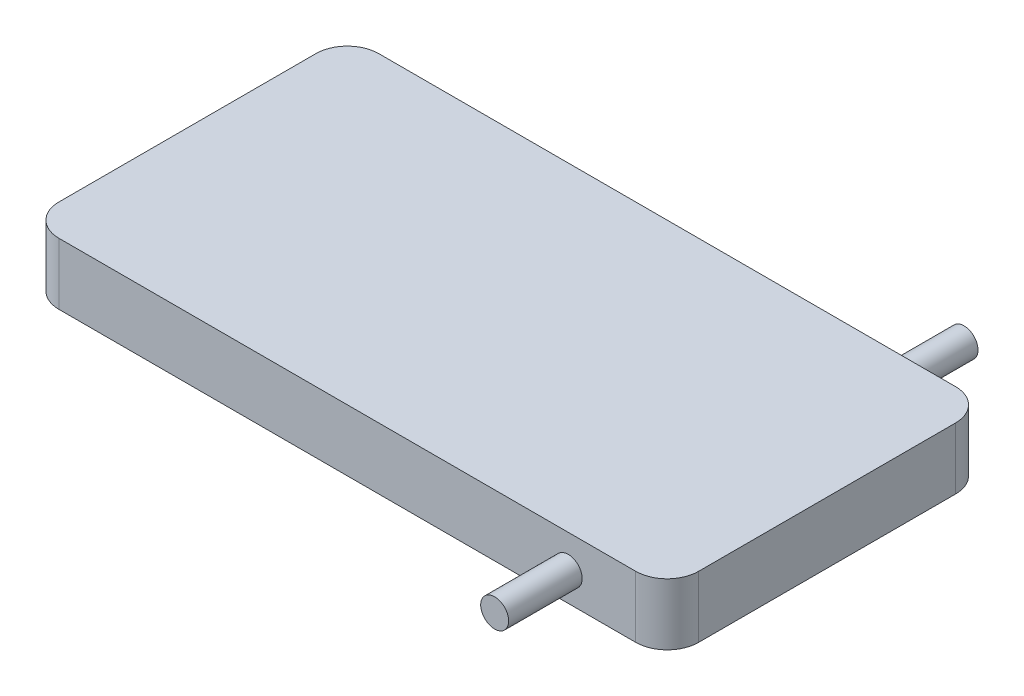
ISO-10303-21;
HEADER;
FILE_DESCRIPTION(('STEP AP214'),'2;1');
FILE_NAME('part.step','',(''),(''),'','','');
FILE_SCHEMA(('AUTOMOTIVE_DESIGN { 1 0 10303 214 1 1 1 1 }'));
ENDSEC;
DATA;
#1=APPLICATION_CONTEXT('core data for automotive mechanical design processes');
#2=APPLICATION_PROTOCOL_DEFINITION('international standard','automotive_design',2000,#1);
#3=PRODUCT_CONTEXT('',#1,'mechanical');
#4=PRODUCT('Part','Part','',(#3));
#5=PRODUCT_RELATED_PRODUCT_CATEGORY('part','',(#4));
#6=PRODUCT_DEFINITION_FORMATION('','',#4);
#7=PRODUCT_DEFINITION_CONTEXT('part definition',#1,'design');
#8=PRODUCT_DEFINITION('design','',#6,#7);
#9=PRODUCT_DEFINITION_SHAPE('','',#8);
#10=(LENGTH_UNIT() NAMED_UNIT(*) SI_UNIT(.MILLI.,.METRE.));
#11=(NAMED_UNIT(*) PLANE_ANGLE_UNIT() SI_UNIT($,.RADIAN.));
#12=(NAMED_UNIT(*) SI_UNIT($,.STERADIAN.) SOLID_ANGLE_UNIT());
#13=UNCERTAINTY_MEASURE_WITH_UNIT(LENGTH_MEASURE(1.E-05),#10,'distance_accuracy_value','');
#14=(GEOMETRIC_REPRESENTATION_CONTEXT(3) GLOBAL_UNCERTAINTY_ASSIGNED_CONTEXT((#13)) GLOBAL_UNIT_ASSIGNED_CONTEXT((#10,
#11,#12)) REPRESENTATION_CONTEXT('',''));
#15=CARTESIAN_POINT('',(0.,0.,0.));
#16=DIRECTION('',(0.,0.,1.));
#17=DIRECTION('',(1.,0.,0.));
#18=AXIS2_PLACEMENT_3D('',#15,#16,#17);
#19=CARTESIAN_POINT('',(-218.628454726444,19.558,51.1872599212867));
#20=DIRECTION('',(0.,0.,-1.));
#21=DIRECTION('',(-1.,0.,0.));
#22=AXIS2_PLACEMENT_3D('',#19,#20,#21);
#23=PLANE('',#22);
#24=CARTESIAN_POINT('',(-46.8713255937331,9.04946312860302,51.1872599212867));
#25=DIRECTION('',(0.,0.,-1.));
#26=DIRECTION('',(-1.,0.,0.));
#27=AXIS2_PLACEMENT_3D('',#24,#25,#26);
#28=CIRCLE('',#27,4.445);
#29=CARTESIAN_POINT('',(-51.3163255937331,9.04946312860302,51.1872599212867));
#30=VERTEX_POINT('',#29);
#31=EDGE_CURVE('E42',#30,#30,#28,.T.);
#32=ORIENTED_EDGE('',*,*,#31,.T.);
#33=EDGE_LOOP('',(#32));
#34=FACE_BOUND('',#33,.T.);
#35=DIRECTION('',(1.,0.,0.));
#36=VECTOR('',#35,1.);
#37=CARTESIAN_POINT('',(-218.628454726444,19.558,51.1872599212867));
#38=LINE('',#37,#36);
#39=CARTESIAN_POINT('',(-208.628454726444,19.558,51.1872599212867));
#40=VERTEX_POINT('',#39);
#41=CARTESIAN_POINT('',(-25.4284547264436,19.558,51.1872599212867));
#42=VERTEX_POINT('',#41);
#43=EDGE_CURVE('E186',#40,#42,#38,.T.);
#44=ORIENTED_EDGE('',*,*,#43,.F.);
#45=DIRECTION('',(0.,-1.,0.));
#46=VECTOR('',#45,1.);
#47=CARTESIAN_POINT('',(-208.628454726444,19.558,51.1872599212867));
#48=LINE('',#47,#46);
#49=CARTESIAN_POINT('',(-208.628454726444,0.,51.1872599212867));
#50=VERTEX_POINT('',#49);
#51=EDGE_CURVE('E153',#40,#50,#48,.T.);
#52=ORIENTED_EDGE('',*,*,#51,.T.);
#53=DIRECTION('',(1.,0.,0.));
#54=VECTOR('',#53,1.);
#55=CARTESIAN_POINT('',(-218.628454726444,0.,51.1872599212867));
#56=LINE('',#55,#54);
#57=CARTESIAN_POINT('',(-25.4284547264436,0.,51.1872599212867));
#58=VERTEX_POINT('',#57);
#59=EDGE_CURVE('E110',#50,#58,#56,.T.);
#60=ORIENTED_EDGE('',*,*,#59,.T.);
#61=DIRECTION('',(0.,-1.,0.));
#62=VECTOR('',#61,1.);
#63=CARTESIAN_POINT('',(-25.4284547264436,19.558,51.1872599212867));
#64=LINE('',#63,#62);
#65=EDGE_CURVE('E118',#58,#42,#64,.F.);
#66=ORIENTED_EDGE('',*,*,#65,.T.);
#67=EDGE_LOOP('',(#44,#52,#60,#66));
#68=FACE_BOUND('',#67,.T.);
#69=ADVANCED_FACE('F38',(#34,#68),#23,.F.);
#70=CARTESIAN_POINT('',(-15.4284547264436,19.558,-50.4127400787133));
#71=DIRECTION('',(1.,0.,0.));
#72=DIRECTION('',(0.,0.,-1.));
#73=AXIS2_PLACEMENT_3D('',#70,#71,#72);
#74=PLANE('',#73);
#75=DIRECTION('',(0.,0.,1.));
#76=VECTOR('',#75,1.);
#77=CARTESIAN_POINT('',(-15.4284547264436,0.,-50.4127400787133));
#78=LINE('',#77,#76);
#79=CARTESIAN_POINT('',(-15.4284547264436,0.,-40.4127400787133));
#80=VERTEX_POINT('',#79);
#81=CARTESIAN_POINT('',(-15.4284547264436,0.,41.1872599212867));
#82=VERTEX_POINT('',#81);
#83=EDGE_CURVE('E101',#80,#82,#78,.T.);
#84=ORIENTED_EDGE('',*,*,#83,.F.);
#85=DIRECTION('',(0.,-1.,0.));
#86=VECTOR('',#85,1.);
#87=CARTESIAN_POINT('',(-15.4284547264436,19.558,-40.4127400787133));
#88=LINE('',#87,#86);
#89=CARTESIAN_POINT('',(-15.4284547264436,19.558,-40.4127400787133));
#90=VERTEX_POINT('',#89);
#91=EDGE_CURVE('E48',#80,#90,#88,.F.);
#92=ORIENTED_EDGE('',*,*,#91,.T.);
#93=DIRECTION('',(0.,0.,1.));
#94=VECTOR('',#93,1.);
#95=CARTESIAN_POINT('',(-15.4284547264436,19.558,-50.4127400787133));
#96=LINE('',#95,#94);
#97=CARTESIAN_POINT('',(-15.4284547264436,19.558,41.1872599212867));
#98=VERTEX_POINT('',#97);
#99=EDGE_CURVE('E122',#90,#98,#96,.T.);
#100=ORIENTED_EDGE('',*,*,#99,.T.);
#101=DIRECTION('',(0.,-1.,0.));
#102=VECTOR('',#101,1.);
#103=CARTESIAN_POINT('',(-15.4284547264436,0.,41.1872599212867));
#104=LINE('',#103,#102);
#105=EDGE_CURVE('E116',#98,#82,#104,.T.);
#106=ORIENTED_EDGE('',*,*,#105,.T.);
#107=EDGE_LOOP('',(#84,#92,#100,#106));
#108=FACE_BOUND('',#107,.T.);
#109=ADVANCED_FACE('F121',(#108),#74,.T.);
#110=CARTESIAN_POINT('',(-218.628454726444,19.558,-50.4127400787133));
#111=DIRECTION('',(0.,0.,-1.));
#112=DIRECTION('',(-1.,0.,0.));
#113=AXIS2_PLACEMENT_3D('',#110,#111,#112);
#114=PLANE('',#113);
#115=CARTESIAN_POINT('',(-46.8713255937331,9.04946312860302,-50.4127400787133));
#116=DIRECTION('',(0.,0.,-1.));
#117=DIRECTION('',(-1.,0.,0.));
#118=AXIS2_PLACEMENT_3D('',#115,#116,#117);
#119=CIRCLE('',#118,4.445);
#120=CARTESIAN_POINT('',(-42.4263255937331,9.04946312860302,-50.4127400787133));
#121=VERTEX_POINT('',#120);
#122=EDGE_CURVE('E197',#121,#121,#119,.T.);
#123=ORIENTED_EDGE('',*,*,#122,.F.);
#124=EDGE_LOOP('',(#123));
#125=FACE_BOUND('',#124,.T.);
#126=DIRECTION('',(1.,0.,0.));
#127=VECTOR('',#126,1.);
#128=CARTESIAN_POINT('',(-218.628454726444,19.558,-50.4127400787133));
#129=LINE('',#128,#127);
#130=CARTESIAN_POINT('',(-208.628454726444,19.558,-50.4127400787133));
#131=VERTEX_POINT('',#130);
#132=CARTESIAN_POINT('',(-25.4284547264436,19.558,-50.4127400787133));
#133=VERTEX_POINT('',#132);
#134=EDGE_CURVE('E129',#131,#133,#129,.T.);
#135=ORIENTED_EDGE('',*,*,#134,.T.);
#136=DIRECTION('',(0.,-1.,0.));
#137=VECTOR('',#136,1.);
#138=CARTESIAN_POINT('',(-25.4284547264436,19.558,-50.4127400787133));
#139=LINE('',#138,#137);
#140=CARTESIAN_POINT('',(-25.4284547264436,0.,-50.4127400787133));
#141=VERTEX_POINT('',#140);
#142=EDGE_CURVE('E166',#133,#141,#139,.T.);
#143=ORIENTED_EDGE('',*,*,#142,.T.);
#144=DIRECTION('',(1.,0.,0.));
#145=VECTOR('',#144,1.);
#146=CARTESIAN_POINT('',(-218.628454726444,0.,-50.4127400787133));
#147=LINE('',#146,#145);
#148=CARTESIAN_POINT('',(-208.628454726444,0.,-50.4127400787133));
#149=VERTEX_POINT('',#148);
#150=EDGE_CURVE('E109',#149,#141,#147,.T.);
#151=ORIENTED_EDGE('',*,*,#150,.F.);
#152=DIRECTION('',(0.,-1.,0.));
#153=VECTOR('',#152,1.);
#154=CARTESIAN_POINT('',(-208.628454726444,19.558,-50.4127400787133));
#155=LINE('',#154,#153);
#156=EDGE_CURVE('E147',#149,#131,#155,.F.);
#157=ORIENTED_EDGE('',*,*,#156,.T.);
#158=EDGE_LOOP('',(#135,#143,#151,#157));
#159=FACE_BOUND('',#158,.T.);
#160=ADVANCED_FACE('F177',(#125,#159),#114,.T.);
#161=CARTESIAN_POINT('',(-218.628454726444,19.558,-50.4127400787133));
#162=DIRECTION('',(1.,0.,0.));
#163=DIRECTION('',(0.,0.,-1.));
#164=AXIS2_PLACEMENT_3D('',#161,#162,#163);
#165=PLANE('',#164);
#166=DIRECTION('',(0.,0.,1.));
#167=VECTOR('',#166,1.);
#168=CARTESIAN_POINT('',(-218.628454726444,0.,-50.4127400787133));
#169=LINE('',#168,#167);
#170=CARTESIAN_POINT('',(-218.628454726444,0.,-40.4127400787133));
#171=VERTEX_POINT('',#170);
#172=CARTESIAN_POINT('',(-218.628454726444,0.,41.1872599212867));
#173=VERTEX_POINT('',#172);
#174=EDGE_CURVE('E132',#171,#173,#169,.T.);
#175=ORIENTED_EDGE('',*,*,#174,.T.);
#176=DIRECTION('',(0.,-1.,0.));
#177=VECTOR('',#176,1.);
#178=CARTESIAN_POINT('',(-218.628454726444,19.558,41.1872599212867));
#179=LINE('',#178,#177);
#180=CARTESIAN_POINT('',(-218.628454726444,19.558,41.1872599212867));
#181=VERTEX_POINT('',#180);
#182=EDGE_CURVE('E160',#173,#181,#179,.F.);
#183=ORIENTED_EDGE('',*,*,#182,.T.);
#184=DIRECTION('',(0.,0.,1.));
#185=VECTOR('',#184,1.);
#186=CARTESIAN_POINT('',(-218.628454726444,19.558,-50.4127400787133));
#187=LINE('',#186,#185);
#188=CARTESIAN_POINT('',(-218.628454726444,19.558,-40.4127400787133));
#189=VERTEX_POINT('',#188);
#190=EDGE_CURVE('E125',#189,#181,#187,.T.);
#191=ORIENTED_EDGE('',*,*,#190,.F.);
#192=DIRECTION('',(0.,-1.,0.));
#193=VECTOR('',#192,1.);
#194=CARTESIAN_POINT('',(-218.628454726444,0.,-40.4127400787133));
#195=LINE('',#194,#193);
#196=EDGE_CURVE('E140',#189,#171,#195,.T.);
#197=ORIENTED_EDGE('',*,*,#196,.T.);
#198=EDGE_LOOP('',(#175,#183,#191,#197));
#199=FACE_BOUND('',#198,.T.);
#200=ADVANCED_FACE('F237',(#199),#165,.F.);
#201=CARTESIAN_POINT('',(0.,19.558,0.));
#202=DIRECTION('',(0.,-1.,0.));
#203=DIRECTION('',(0.,0.,-1.));
#204=AXIS2_PLACEMENT_3D('',#201,#202,#203);
#205=PLANE('',#204);
#206=ORIENTED_EDGE('',*,*,#99,.F.);
#207=CARTESIAN_POINT('',(-25.4284547264436,19.558,-40.4127400787133));
#208=DIRECTION('',(0.,-1.,0.));
#209=DIRECTION('',(0.,0.,-1.));
#210=AXIS2_PLACEMENT_3D('',#207,#208,#209);
#211=CIRCLE('',#210,10.);
#212=EDGE_CURVE('E11',#90,#133,#211,.F.);
#213=ORIENTED_EDGE('',*,*,#212,.T.);
#214=ORIENTED_EDGE('',*,*,#134,.F.);
#215=CARTESIAN_POINT('',(-208.628454726444,19.558,-40.4127400787133));
#216=DIRECTION('',(0.,-1.,0.));
#217=DIRECTION('',(0.,0.,-1.));
#218=AXIS2_PLACEMENT_3D('',#215,#216,#217);
#219=CIRCLE('',#218,10.);
#220=EDGE_CURVE('E150',#131,#189,#219,.F.);
#221=ORIENTED_EDGE('',*,*,#220,.T.);
#222=ORIENTED_EDGE('',*,*,#190,.T.);
#223=CARTESIAN_POINT('',(-208.628454726444,19.558,41.1872599212867));
#224=DIRECTION('',(0.,-1.,0.));
#225=DIRECTION('',(0.,0.,-1.));
#226=AXIS2_PLACEMENT_3D('',#223,#224,#225);
#227=CIRCLE('',#226,10.);
#228=EDGE_CURVE('E163',#181,#40,#227,.F.);
#229=ORIENTED_EDGE('',*,*,#228,.T.);
#230=ORIENTED_EDGE('',*,*,#43,.T.);
#231=CARTESIAN_POINT('',(-25.4284547264436,19.558,41.1872599212867));
#232=DIRECTION('',(0.,-1.,0.));
#233=DIRECTION('',(0.,0.,-1.));
#234=AXIS2_PLACEMENT_3D('',#231,#232,#233);
#235=CIRCLE('',#234,10.);
#236=EDGE_CURVE('E137',#42,#98,#235,.F.);
#237=ORIENTED_EDGE('',*,*,#236,.T.);
#238=EDGE_LOOP('',(#206,#213,#214,#221,#222,#229,#230,#237));
#239=FACE_BOUND('',#238,.T.);
#240=ADVANCED_FACE('F227',(#239),#205,.F.);
#241=CARTESIAN_POINT('',(0.,0.,0.));
#242=DIRECTION('',(0.,-1.,0.));
#243=DIRECTION('',(0.,0.,-1.));
#244=AXIS2_PLACEMENT_3D('',#241,#242,#243);
#245=PLANE('',#244);
#246=CARTESIAN_POINT('',(-175.512993916797,0.,2.18861061419208));
#247=DIRECTION('',(0.,-1.,0.));
#248=DIRECTION('',(0.,0.,-1.));
#249=AXIS2_PLACEMENT_3D('',#246,#247,#248);
#250=CIRCLE('',#249,19.05);
#251=CARTESIAN_POINT('',(-175.512993916797,0.,-16.8613893858079));
#252=VERTEX_POINT('',#251);
#253=EDGE_CURVE('E209',#252,#252,#250,.T.);
#254=ORIENTED_EDGE('',*,*,#253,.F.);
#255=EDGE_LOOP('',(#254));
#256=FACE_BOUND('',#255,.T.);
#257=ORIENTED_EDGE('',*,*,#150,.T.);
#258=CARTESIAN_POINT('',(-25.4284547264436,0.,-40.4127400787133));
#259=DIRECTION('',(0.,-1.,0.));
#260=DIRECTION('',(0.,0.,-1.));
#261=AXIS2_PLACEMENT_3D('',#258,#259,#260);
#262=CIRCLE('',#261,10.);
#263=EDGE_CURVE('E62',#141,#80,#262,.T.);
#264=ORIENTED_EDGE('',*,*,#263,.T.);
#265=ORIENTED_EDGE('',*,*,#83,.T.);
#266=CARTESIAN_POINT('',(-25.4284547264436,0.,41.1872599212867));
#267=DIRECTION('',(0.,-1.,0.));
#268=DIRECTION('',(0.,0.,-1.));
#269=AXIS2_PLACEMENT_3D('',#266,#267,#268);
#270=CIRCLE('',#269,10.);
#271=EDGE_CURVE('E105',#82,#58,#270,.T.);
#272=ORIENTED_EDGE('',*,*,#271,.T.);
#273=ORIENTED_EDGE('',*,*,#59,.F.);
#274=CARTESIAN_POINT('',(-208.628454726444,0.,41.1872599212867));
#275=DIRECTION('',(0.,-1.,0.));
#276=DIRECTION('',(0.,0.,-1.));
#277=AXIS2_PLACEMENT_3D('',#274,#275,#276);
#278=CIRCLE('',#277,10.);
#279=EDGE_CURVE('E157',#50,#173,#278,.T.);
#280=ORIENTED_EDGE('',*,*,#279,.T.);
#281=ORIENTED_EDGE('',*,*,#174,.F.);
#282=CARTESIAN_POINT('',(-208.628454726444,0.,-40.4127400787133));
#283=DIRECTION('',(0.,-1.,0.));
#284=DIRECTION('',(0.,0.,-1.));
#285=AXIS2_PLACEMENT_3D('',#282,#283,#284);
#286=CIRCLE('',#285,10.);
#287=EDGE_CURVE('E144',#171,#149,#286,.T.);
#288=ORIENTED_EDGE('',*,*,#287,.T.);
#289=EDGE_LOOP('',(#257,#264,#265,#272,#273,#280,#281,#288));
#290=FACE_BOUND('',#289,.T.);
#291=ADVANCED_FACE('F103',(#256,#290),#245,.T.);
#292=CARTESIAN_POINT('',(-25.4284547264436,19.558,41.1872599212867));
#293=DIRECTION('',(0.,1.,0.));
#294=DIRECTION('',(0.,0.,1.));
#295=AXIS2_PLACEMENT_3D('',#292,#293,#294);
#296=CYLINDRICAL_SURFACE('',#295,10.);
#297=ORIENTED_EDGE('',*,*,#236,.F.);
#298=ORIENTED_EDGE('',*,*,#65,.F.);
#299=ORIENTED_EDGE('',*,*,#271,.F.);
#300=ORIENTED_EDGE('',*,*,#105,.F.);
#301=EDGE_LOOP('',(#297,#298,#299,#300));
#302=FACE_BOUND('',#301,.T.);
#303=ADVANCED_FACE('F115',(#302),#296,.T.);
#304=CARTESIAN_POINT('',(-208.628454726444,19.558,-40.4127400787133));
#305=DIRECTION('',(0.,1.,0.));
#306=DIRECTION('',(0.,0.,1.));
#307=AXIS2_PLACEMENT_3D('',#304,#305,#306);
#308=CYLINDRICAL_SURFACE('',#307,10.);
#309=ORIENTED_EDGE('',*,*,#220,.F.);
#310=ORIENTED_EDGE('',*,*,#156,.F.);
#311=ORIENTED_EDGE('',*,*,#287,.F.);
#312=ORIENTED_EDGE('',*,*,#196,.F.);
#313=EDGE_LOOP('',(#309,#310,#311,#312));
#314=FACE_BOUND('',#313,.T.);
#315=ADVANCED_FACE('F234',(#314),#308,.T.);
#316=CARTESIAN_POINT('',(-208.628454726444,19.558,41.1872599212867));
#317=DIRECTION('',(0.,-1.,0.));
#318=DIRECTION('',(0.,0.,-1.));
#319=AXIS2_PLACEMENT_3D('',#316,#317,#318);
#320=CYLINDRICAL_SURFACE('',#319,10.);
#321=ORIENTED_EDGE('',*,*,#228,.F.);
#322=ORIENTED_EDGE('',*,*,#182,.F.);
#323=ORIENTED_EDGE('',*,*,#279,.F.);
#324=ORIENTED_EDGE('',*,*,#51,.F.);
#325=EDGE_LOOP('',(#321,#322,#323,#324));
#326=FACE_BOUND('',#325,.T.);
#327=ADVANCED_FACE('F253',(#326),#320,.T.);
#328=CARTESIAN_POINT('',(-25.4284547264436,19.558,-40.4127400787133));
#329=DIRECTION('',(0.,-1.,0.));
#330=DIRECTION('',(0.,0.,-1.));
#331=AXIS2_PLACEMENT_3D('',#328,#329,#330);
#332=CYLINDRICAL_SURFACE('',#331,10.);
#333=ORIENTED_EDGE('',*,*,#212,.F.);
#334=ORIENTED_EDGE('',*,*,#91,.F.);
#335=ORIENTED_EDGE('',*,*,#263,.F.);
#336=ORIENTED_EDGE('',*,*,#142,.F.);
#337=EDGE_LOOP('',(#333,#334,#335,#336));
#338=FACE_BOUND('',#337,.T.);
#339=ADVANCED_FACE('F40',(#338),#332,.T.);
#340=CARTESIAN_POINT('',(-46.8713255937331,9.04946312860302,-74.5427400787133));
#341=DIRECTION('',(0.,0.,1.));
#342=DIRECTION('',(1.,0.,0.));
#343=AXIS2_PLACEMENT_3D('',#340,#341,#342);
#344=CYLINDRICAL_SURFACE('',#343,4.445);
#345=CARTESIAN_POINT('',(-46.8713255937331,9.04946312860302,-74.5427400787133));
#346=DIRECTION('',(0.,0.,-1.));
#347=DIRECTION('',(-1.,0.,0.));
#348=AXIS2_PLACEMENT_3D('',#345,#346,#347);
#349=CIRCLE('',#348,4.445);
#350=CARTESIAN_POINT('',(-42.4263255937331,9.04946312860302,-74.5427400787133));
#351=VERTEX_POINT('',#350);
#352=EDGE_CURVE('E189',#351,#351,#349,.T.);
#353=CARTESIAN_POINT('',(-42.4263255937331,9.04946312860302,-74.5427400787133));
#354=CARTESIAN_POINT('',(-42.4263255937331,9.04946312860302,-74.2913859120466));
#355=CARTESIAN_POINT('',(-42.4263255937331,9.04946312860302,-74.0400317453799));
#356=CARTESIAN_POINT('',(-42.4263255937331,9.04946312860302,-73.5373234120466));
#357=CARTESIAN_POINT('',(-42.4263255937331,9.04946312860302,-73.2859692453799));
#358=CARTESIAN_POINT('',(-42.4263255937331,9.04946312860302,-72.7832609120466));
#359=CARTESIAN_POINT('',(-42.4263255937331,9.04946312860302,-72.5319067453799));
#360=CARTESIAN_POINT('',(-42.4263255937331,9.04946312860302,-72.0291984120466));
#361=CARTESIAN_POINT('',(-42.4263255937331,9.04946312860302,-71.77784424538));
#362=CARTESIAN_POINT('',(-42.4263255937331,9.04946312860302,-71.2751359120466));
#363=CARTESIAN_POINT('',(-42.4263255937331,9.04946312860302,-71.0237817453799));
#364=CARTESIAN_POINT('',(-42.4263255937331,9.04946312860302,-70.5210734120466));
#365=CARTESIAN_POINT('',(-42.4263255937331,9.04946312860302,-70.2697192453799));
#366=CARTESIAN_POINT('',(-42.4263255937331,9.04946312860302,-69.7670109120466));
#367=CARTESIAN_POINT('',(-42.4263255937331,9.04946312860302,-69.5156567453799));
#368=CARTESIAN_POINT('',(-42.4263255937331,9.04946312860302,-69.0129484120466));
#369=CARTESIAN_POINT('',(-42.4263255937331,9.04946312860302,-68.76159424538));
#370=CARTESIAN_POINT('',(-42.4263255937331,9.04946312860302,-68.2588859120466));
#371=CARTESIAN_POINT('',(-42.4263255937331,9.04946312860302,-68.0075317453799));
#372=CARTESIAN_POINT('',(-42.4263255937331,9.04946312860302,-67.5048234120466));
#373=CARTESIAN_POINT('',(-42.4263255937331,9.04946312860302,-67.2534692453799));
#374=CARTESIAN_POINT('',(-42.4263255937331,9.04946312860302,-66.7507609120466));
#375=CARTESIAN_POINT('',(-42.4263255937331,9.04946312860302,-66.4994067453799));
#376=CARTESIAN_POINT('',(-42.4263255937331,9.04946312860302,-65.9966984120466));
#377=CARTESIAN_POINT('',(-42.4263255937331,9.04946312860302,-65.74534424538));
#378=CARTESIAN_POINT('',(-42.4263255937331,9.04946312860302,-65.2426359120466));
#379=CARTESIAN_POINT('',(-42.4263255937331,9.04946312860302,-64.99128174538));
#380=CARTESIAN_POINT('',(-42.4263255937331,9.04946312860302,-64.4885734120466));
#381=CARTESIAN_POINT('',(-42.4263255937331,9.04946312860302,-64.2372192453799));
#382=CARTESIAN_POINT('',(-42.4263255937331,9.04946312860302,-63.7345109120466));
#383=CARTESIAN_POINT('',(-42.4263255937331,9.04946312860302,-63.48315674538));
#384=CARTESIAN_POINT('',(-42.4263255937331,9.04946312860302,-62.9804484120466));
#385=CARTESIAN_POINT('',(-42.4263255937331,9.04946312860302,-62.72909424538));
#386=CARTESIAN_POINT('',(-42.4263255937331,9.04946312860302,-62.2263859120466));
#387=CARTESIAN_POINT('',(-42.4263255937331,9.04946312860302,-61.97503174538));
#388=CARTESIAN_POINT('',(-42.4263255937331,9.04946312860302,-61.4723234120466));
#389=CARTESIAN_POINT('',(-42.4263255937331,9.04946312860302,-61.22096924538));
#390=CARTESIAN_POINT('',(-42.4263255937331,9.04946312860302,-60.7182609120466));
#391=CARTESIAN_POINT('',(-42.4263255937331,9.04946312860302,-60.46690674538));
#392=CARTESIAN_POINT('',(-42.4263255937331,9.04946312860302,-59.9641984120466));
#393=CARTESIAN_POINT('',(-42.4263255937331,9.04946312860302,-59.71284424538));
#394=CARTESIAN_POINT('',(-42.4263255937331,9.04946312860302,-59.2101359120466));
#395=CARTESIAN_POINT('',(-42.4263255937331,9.04946312860302,-58.95878174538));
#396=CARTESIAN_POINT('',(-42.4263255937331,9.04946312860302,-58.4560734120466));
#397=CARTESIAN_POINT('',(-42.4263255937331,9.04946312860302,-58.20471924538));
#398=CARTESIAN_POINT('',(-42.4263255937331,9.04946312860302,-57.7020109120466));
#399=CARTESIAN_POINT('',(-42.4263255937331,9.04946312860302,-57.45065674538));
#400=CARTESIAN_POINT('',(-42.4263255937331,9.04946312860302,-56.9479484120466));
#401=CARTESIAN_POINT('',(-42.4263255937331,9.04946312860302,-56.69659424538));
#402=CARTESIAN_POINT('',(-42.4263255937331,9.04946312860302,-56.1938859120466));
#403=CARTESIAN_POINT('',(-42.4263255937331,9.04946312860302,-55.94253174538));
#404=CARTESIAN_POINT('',(-42.4263255937331,9.04946312860302,-55.4398234120466));
#405=CARTESIAN_POINT('',(-42.4263255937331,9.04946312860302,-55.18846924538));
#406=CARTESIAN_POINT('',(-42.4263255937331,9.04946312860302,-54.6857609120466));
#407=CARTESIAN_POINT('',(-42.4263255937331,9.04946312860302,-54.43440674538));
#408=CARTESIAN_POINT('',(-42.4263255937331,9.04946312860302,-53.9316984120466));
#409=CARTESIAN_POINT('',(-42.4263255937331,9.04946312860302,-53.68034424538));
#410=CARTESIAN_POINT('',(-42.4263255937331,9.04946312860302,-53.1776359120466));
#411=CARTESIAN_POINT('',(-42.4263255937331,9.04946312860302,-52.92628174538));
#412=CARTESIAN_POINT('',(-42.4263255937331,9.04946312860302,-52.4235734120466));
#413=CARTESIAN_POINT('',(-42.4263255937331,9.04946312860302,-52.17221924538));
#414=CARTESIAN_POINT('',(-42.4263255937331,9.04946312860302,-51.6695109120466));
#415=CARTESIAN_POINT('',(-42.4263255937331,9.04946312860302,-51.41815674538));
#416=CARTESIAN_POINT('',(-42.4263255937331,9.04946312860302,-50.9154484120466));
#417=CARTESIAN_POINT('',(-42.4263255937331,9.04946312860302,-50.66409424538));
#418=CARTESIAN_POINT('',(-42.4263255937331,9.04946312860302,-50.4127400787133));
#419=B_SPLINE_CURVE_WITH_KNOTS('',3,(#353,#354,#355,#356,#357,#358,#359,#360,#361,#362,#363,
#364,#365,#366,#367,#368,#369,#370,#371,#372,#373,#374,#375,#376,#377,#378,#379,#380,#381,#382,
#383,#384,#385,#386,#387,#388,#389,#390,#391,#392,#393,#394,#395,#396,#397,#398,#399,#400,#401,
#402,#403,#404,#405,#406,#407,#408,#409,#410,#411,#412,#413,#414,#415,#416,#417,#418),
.UNSPECIFIED.,.F.,.F.,(4,2,2,2,2,2,2,2,2,2,2,2,2,2,2,2,2,2,2,2,2,2,2,2,2,2,2,2,2,2,2,2,4),(0.,
0.7540625,1.508125,2.2621875,3.01625,3.7703125,4.524375,5.2784375,6.0325,6.7865625,7.540625,
8.29468749999999,9.04874999999999,9.80281249999999,10.556875,11.3109375,12.065,12.8190625,
13.573125,14.3271875,15.08125,15.8353125,16.589375,17.3434375,18.0975,18.8515625,19.605625,
20.3596875,21.11375,21.8678125,22.621875,23.3759375,24.13),.UNSPECIFIED.);
#420=EDGE_CURVE('BSEAM260',#351,#121,#419,.T.);
#421=ORIENTED_EDGE('',*,*,#352,.F.);
#422=ORIENTED_EDGE('',*,*,#122,.T.);
#423=ORIENTED_EDGE('',*,*,#420,.T.);
#424=ORIENTED_EDGE('',*,*,#420,.F.);
#425=EDGE_LOOP('',(#421,#423,#422,#424));
#426=FACE_BOUND('',#425,.T.);
#427=ADVANCED_FACE('F260',(#426),#344,.T.);
#428=CARTESIAN_POINT('',(-46.8713255937331,9.04946312860302,-74.5427400787133));
#429=DIRECTION('',(0.,0.,-1.));
#430=DIRECTION('',(-1.,0.,0.));
#431=AXIS2_PLACEMENT_3D('',#428,#429,#430);
#432=PLANE('',#431);
#433=ORIENTED_EDGE('',*,*,#352,.T.);
#434=EDGE_LOOP('',(#433));
#435=FACE_BOUND('',#434,.T.);
#436=ADVANCED_FACE('F279',(#435),#432,.T.);
#437=CARTESIAN_POINT('',(-46.8713255937331,9.04946312860302,74.5427400787133));
#438=DIRECTION('',(0.,0.,-1.));
#439=DIRECTION('',(-1.,0.,0.));
#440=AXIS2_PLACEMENT_3D('',#437,#438,#439);
#441=CYLINDRICAL_SURFACE('',#440,4.445);
#442=CARTESIAN_POINT('',(-46.8713255937331,9.04946312860302,74.5427400787133));
#443=DIRECTION('',(0.,0.,-1.));
#444=DIRECTION('',(-1.,0.,0.));
#445=AXIS2_PLACEMENT_3D('',#442,#443,#444);
#446=CIRCLE('',#445,4.445);
#447=CARTESIAN_POINT('',(-51.3163255937331,9.04946312860302,74.5427400787133));
#448=VERTEX_POINT('',#447);
#449=EDGE_CURVE('E204',#448,#448,#446,.T.);
#450=CARTESIAN_POINT('',(-51.3163255937331,9.04946312860302,74.5427400787133));
#451=CARTESIAN_POINT('',(-51.3163255937331,9.04946312860302,74.2994538270734));
#452=CARTESIAN_POINT('',(-51.3163255937331,9.04946312860302,74.0561675754336));
#453=CARTESIAN_POINT('',(-51.3163255937331,9.04946312860302,73.5695950721539));
#454=CARTESIAN_POINT('',(-51.3163255937331,9.04946312860302,73.326308820514));
#455=CARTESIAN_POINT('',(-51.3163255937331,9.04946312860302,72.8397363172343));
#456=CARTESIAN_POINT('',(-51.3163255937331,9.04946312860302,72.5964500655944));
#457=CARTESIAN_POINT('',(-51.3163255937331,9.04946312860302,72.1098775623147));
#458=CARTESIAN_POINT('',(-51.3163255937331,9.04946312860302,71.8665913106748));
#459=CARTESIAN_POINT('',(-51.3163255937331,9.04946312860302,71.3800188073951));
#460=CARTESIAN_POINT('',(-51.3163255937331,9.04946312860302,71.1367325557553));
#461=CARTESIAN_POINT('',(-51.3163255937331,9.04946312860302,70.6501600524755));
#462=CARTESIAN_POINT('',(-51.3163255937331,9.04946312860302,70.4068738008357));
#463=CARTESIAN_POINT('',(-51.3163255937331,9.04946312860302,69.920301297556));
#464=CARTESIAN_POINT('',(-51.3163255937331,9.04946312860302,69.6770150459161));
#465=CARTESIAN_POINT('',(-51.3163255937331,9.04946312860302,69.1904425426364));
#466=CARTESIAN_POINT('',(-51.3163255937331,9.04946312860302,68.9471562909965));
#467=CARTESIAN_POINT('',(-51.3163255937331,9.04946312860302,68.4605837877168));
#468=CARTESIAN_POINT('',(-51.3163255937331,9.04946312860302,68.2172975360769));
#469=CARTESIAN_POINT('',(-51.3163255937331,9.04946312860302,67.7307250327972));
#470=CARTESIAN_POINT('',(-51.3163255937331,9.04946312860302,67.4874387811573));
#471=CARTESIAN_POINT('',(-51.3163255937331,9.04946312860302,67.0008662778776));
#472=CARTESIAN_POINT('',(-51.3163255937331,9.04946312860302,66.7575800262378));
#473=CARTESIAN_POINT('',(-51.3163255937331,9.04946312860302,66.2710075229581));
#474=CARTESIAN_POINT('',(-51.3163255937331,9.04946312860302,66.0277212713182));
#475=CARTESIAN_POINT('',(-51.3163255937331,9.04946312860302,65.5411487680385));
#476=CARTESIAN_POINT('',(-51.3163255937331,9.04946312860302,65.2978625163986));
#477=CARTESIAN_POINT('',(-51.3163255937331,9.04946312860302,64.8112900131189));
#478=CARTESIAN_POINT('',(-51.3163255937331,9.04946312860302,64.568003761479));
#479=CARTESIAN_POINT('',(-51.3163255937331,9.04946312860302,64.0814312581993));
#480=CARTESIAN_POINT('',(-51.3163255937331,9.04946312860302,63.8381450065594));
#481=CARTESIAN_POINT('',(-51.3163255937331,9.04946312860302,63.3515725032797));
#482=CARTESIAN_POINT('',(-51.3163255937331,9.04946312860302,63.1082862516399));
#483=CARTESIAN_POINT('',(-51.3163255937331,9.04946312860302,62.6217137483602));
#484=CARTESIAN_POINT('',(-51.3163255937331,9.04946312860302,62.3784274967203));
#485=CARTESIAN_POINT('',(-51.3163255937331,9.04946312860302,61.8918549934406));
#486=CARTESIAN_POINT('',(-51.3163255937331,9.04946312860302,61.6485687418007));
#487=CARTESIAN_POINT('',(-51.3163255937331,9.04946312860302,61.161996238521));
#488=CARTESIAN_POINT('',(-51.3163255937331,9.04946312860302,60.9187099868811));
#489=CARTESIAN_POINT('',(-51.3163255937331,9.04946312860302,60.4321374836014));
#490=CARTESIAN_POINT('',(-51.3163255937331,9.04946312860302,60.1888512319615));
#491=CARTESIAN_POINT('',(-51.3163255937331,9.04946312860302,59.7022787286818));
#492=CARTESIAN_POINT('',(-51.3163255937331,9.04946312860302,59.458992477042));
#493=CARTESIAN_POINT('',(-51.3163255937331,9.04946312860302,58.9724199737622));
#494=CARTESIAN_POINT('',(-51.3163255937331,9.04946312860302,58.7291337221224));
#495=CARTESIAN_POINT('',(-51.3163255937331,9.04946312860302,58.2425612188427));
#496=CARTESIAN_POINT('',(-51.3163255937331,9.04946312860302,57.9992749672028));
#497=CARTESIAN_POINT('',(-51.3163255937331,9.04946312860302,57.5127024639231));
#498=CARTESIAN_POINT('',(-51.3163255937331,9.04946312860302,57.2694162122832));
#499=CARTESIAN_POINT('',(-51.3163255937331,9.04946312860302,56.7828437090035));
#500=CARTESIAN_POINT('',(-51.3163255937331,9.04946312860302,56.5395574573636));
#501=CARTESIAN_POINT('',(-51.3163255937331,9.04946312860302,56.0529849540839));
#502=CARTESIAN_POINT('',(-51.3163255937331,9.04946312860302,55.8096987024441));
#503=CARTESIAN_POINT('',(-51.3163255937331,9.04946312860302,55.3231261991643));
#504=CARTESIAN_POINT('',(-51.3163255937331,9.04946312860302,55.0798399475245));
#505=CARTESIAN_POINT('',(-51.3163255937331,9.04946312860302,54.5932674442447));
#506=CARTESIAN_POINT('',(-51.3163255937331,9.04946312860302,54.3499811926049));
#507=CARTESIAN_POINT('',(-51.3163255937331,9.04946312860302,53.8634086893252));
#508=CARTESIAN_POINT('',(-51.3163255937331,9.04946312860302,53.6201224376853));
#509=CARTESIAN_POINT('',(-51.3163255937331,9.04946312860302,53.1335499344056));
#510=CARTESIAN_POINT('',(-51.3163255937331,9.04946312860302,52.8902636827657));
#511=CARTESIAN_POINT('',(-51.3163255937331,9.04946312860302,52.403691179486));
#512=CARTESIAN_POINT('',(-51.3163255937331,9.04946312860302,52.1604049278461));
#513=CARTESIAN_POINT('',(-51.3163255937331,9.04946312860302,51.6738324245664));
#514=CARTESIAN_POINT('',(-51.3163255937331,9.04946312860302,51.4305461729266));
#515=CARTESIAN_POINT('',(-51.3163255937331,9.04946312860302,51.1872599212867));
#516=B_SPLINE_CURVE_WITH_KNOTS('',3,(#450,#451,#452,#453,#454,#455,#456,#457,#458,#459,#460,
#461,#462,#463,#464,#465,#466,#467,#468,#469,#470,#471,#472,#473,#474,#475,#476,#477,#478,#479,
#480,#481,#482,#483,#484,#485,#486,#487,#488,#489,#490,#491,#492,#493,#494,#495,#496,#497,#498,
#499,#500,#501,#502,#503,#504,#505,#506,#507,#508,#509,#510,#511,#512,#513,#514,#515),
.UNSPECIFIED.,.F.,.F.,(4,2,2,2,2,2,2,2,2,2,2,2,2,2,2,2,2,2,2,2,2,2,2,2,2,2,2,2,2,2,2,2,4),(0.,
0.729858754919585,1.45971750983917,2.18957626475876,2.91943501967833,3.64929377459791,
4.3791525295175,5.10901128443708,5.83887003935665,6.56872879427624,7.29858754919582,
8.02844630411539,8.75830505903498,9.48816381395456,10.2180225688741,10.9478813237937,
11.6777400787133,12.4075988336329,13.1374575885525,13.8673163434721,14.5971750983916,
15.3270338533112,16.0568926082308,16.7867513631504,17.51661011807,18.2464688729895,
18.9763276279091,19.7061863828287,20.4360451377483,21.1659038926679,21.8957626475874,
22.625621402507,23.3554801574266),.UNSPECIFIED.);
#517=EDGE_CURVE('BSEAM285',#448,#30,#516,.T.);
#518=ORIENTED_EDGE('',*,*,#449,.T.);
#519=ORIENTED_EDGE('',*,*,#31,.F.);
#520=ORIENTED_EDGE('',*,*,#517,.T.);
#521=ORIENTED_EDGE('',*,*,#517,.F.);
#522=EDGE_LOOP('',(#518,#520,#519,#521));
#523=FACE_BOUND('',#522,.T.);
#524=ADVANCED_FACE('F285',(#523),#441,.T.);
#525=CARTESIAN_POINT('',(-46.8713255937331,9.04946312860302,74.5427400787133));
#526=DIRECTION('',(0.,0.,1.));
#527=DIRECTION('',(-1.,0.,0.));
#528=AXIS2_PLACEMENT_3D('',#525,#526,#527);
#529=PLANE('',#528);
#530=ORIENTED_EDGE('',*,*,#449,.F.);
#531=EDGE_LOOP('',(#530));
#532=FACE_BOUND('',#531,.T.);
#533=ADVANCED_FACE('F222',(#532),#529,.T.);
#534=CARTESIAN_POINT('',(-175.512993916797,2.54,2.18861061419208));
#535=DIRECTION('',(0.,-1.,0.));
#536=DIRECTION('',(0.,0.,-1.));
#537=AXIS2_PLACEMENT_3D('',#534,#535,#536);
#538=CYLINDRICAL_SURFACE('',#537,19.05);
#539=CARTESIAN_POINT('',(-175.512993916797,2.54,2.18861061419208));
#540=DIRECTION('',(0.,-1.,0.));
#541=DIRECTION('',(0.,0.,-1.));
#542=AXIS2_PLACEMENT_3D('',#539,#540,#541);
#543=CIRCLE('',#542,19.05);
#544=CARTESIAN_POINT('',(-175.512993916797,2.54,-16.8613893858079));
#545=VERTEX_POINT('',#544);
#546=EDGE_CURVE('E208',#545,#545,#543,.T.);
#547=ORIENTED_EDGE('',*,*,#546,.F.);
#548=EDGE_LOOP('',(#547));
#549=FACE_BOUND('',#548,.T.);
#550=ORIENTED_EDGE('',*,*,#253,.T.);
#551=EDGE_LOOP('',(#550));
#552=FACE_BOUND('',#551,.T.);
#553=ADVANCED_FACE('F219',(#549,#552),#538,.F.);
#554=CARTESIAN_POINT('',(-175.512993916797,2.54,2.18861061419208));
#555=DIRECTION('',(0.,-1.,0.));
#556=DIRECTION('',(0.,0.,-1.));
#557=AXIS2_PLACEMENT_3D('',#554,#555,#556);
#558=PLANE('',#557);
#559=ORIENTED_EDGE('',*,*,#546,.T.);
#560=EDGE_LOOP('',(#559));
#561=FACE_BOUND('',#560,.T.);
#562=ADVANCED_FACE('F217',(#561),#558,.T.);
#563=CLOSED_SHELL('',(#69,#109,#160,#200,#240,#291,#303,#315,#327,#339,#427,#436,#524,#533,#553,#562));
#564=MANIFOLD_SOLID_BREP('B2',#563);
#565=ADVANCED_BREP_SHAPE_REPRESENTATION('',(#18,#564),#14);
#566=SHAPE_DEFINITION_REPRESENTATION(#9,#565);
ENDSEC;
END-ISO-10303-21;
